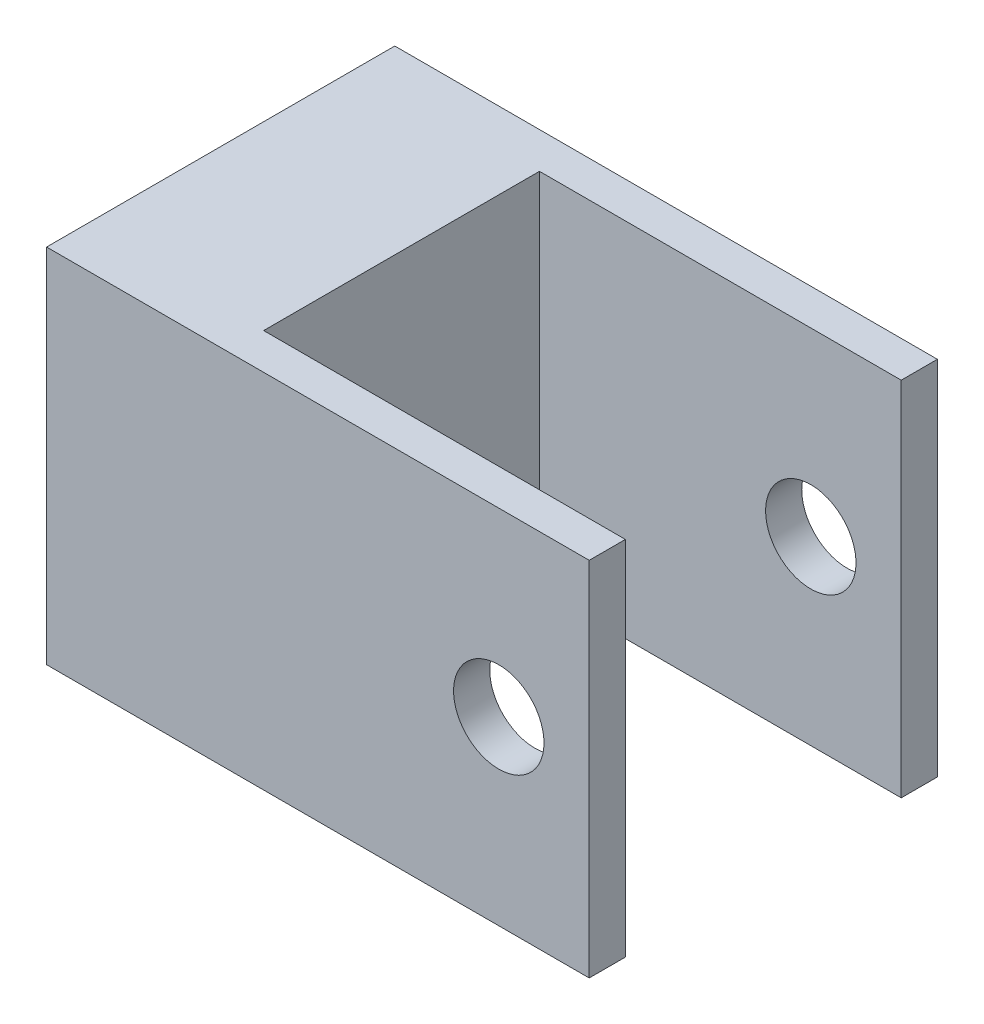
ISO-10303-21;
HEADER;
FILE_DESCRIPTION(('STEP AP214'),'2;1');
FILE_NAME('part.step','',(''),(''),'','','');
FILE_SCHEMA(('AUTOMOTIVE_DESIGN { 1 0 10303 214 1 1 1 1 }'));
ENDSEC;
DATA;
#1=APPLICATION_CONTEXT('core data for automotive mechanical design processes');
#2=APPLICATION_PROTOCOL_DEFINITION('international standard','automotive_design',2000,#1);
#3=PRODUCT_CONTEXT('',#1,'mechanical');
#4=PRODUCT('Part','Part','',(#3));
#5=PRODUCT_RELATED_PRODUCT_CATEGORY('part','',(#4));
#6=PRODUCT_DEFINITION_FORMATION('','',#4);
#7=PRODUCT_DEFINITION_CONTEXT('part definition',#1,'design');
#8=PRODUCT_DEFINITION('design','',#6,#7);
#9=PRODUCT_DEFINITION_SHAPE('','',#8);
#10=(LENGTH_UNIT() NAMED_UNIT(*) SI_UNIT(.MILLI.,.METRE.));
#11=(NAMED_UNIT(*) PLANE_ANGLE_UNIT() SI_UNIT($,.RADIAN.));
#12=(NAMED_UNIT(*) SI_UNIT($,.STERADIAN.) SOLID_ANGLE_UNIT());
#13=UNCERTAINTY_MEASURE_WITH_UNIT(LENGTH_MEASURE(1.E-05),#10,'distance_accuracy_value','');
#14=(GEOMETRIC_REPRESENTATION_CONTEXT(3) GLOBAL_UNCERTAINTY_ASSIGNED_CONTEXT((#13)) GLOBAL_UNIT_ASSIGNED_CONTEXT((#10,
#11,#12)) REPRESENTATION_CONTEXT('',''));
#15=CARTESIAN_POINT('',(0.,0.,0.));
#16=DIRECTION('',(0.,0.,1.));
#17=DIRECTION('',(1.,0.,0.));
#18=AXIS2_PLACEMENT_3D('',#15,#16,#17);
#19=CARTESIAN_POINT('',(120.,-40.,38.5));
#20=DIRECTION('',(1.,0.,0.));
#21=DIRECTION('',(0.,0.,-1.));
#22=AXIS2_PLACEMENT_3D('',#19,#20,#21);
#23=PLANE('',#22);
#24=DIRECTION('',(0.,0.,-1.));
#25=VECTOR('',#24,1.);
#26=CARTESIAN_POINT('',(120.,-40.,38.5));
#27=LINE('',#26,#25);
#28=CARTESIAN_POINT('',(120.,-40.,38.5));
#29=VERTEX_POINT('',#28);
#30=CARTESIAN_POINT('',(120.,-40.,30.5));
#31=VERTEX_POINT('',#30);
#32=EDGE_CURVE('E150',#29,#31,#27,.T.);
#33=ORIENTED_EDGE('',*,*,#32,.T.);
#34=DIRECTION('',(0.,1.,0.));
#35=VECTOR('',#34,1.);
#36=CARTESIAN_POINT('',(120.,-100.,30.5));
#37=LINE('',#36,#35);
#38=CARTESIAN_POINT('',(120.,40.,30.5));
#39=VERTEX_POINT('',#38);
#40=EDGE_CURVE('E130',#31,#39,#37,.T.);
#41=ORIENTED_EDGE('',*,*,#40,.T.);
#42=DIRECTION('',(0.,0.,-1.));
#43=VECTOR('',#42,1.);
#44=CARTESIAN_POINT('',(120.,40.,38.5));
#45=LINE('',#44,#43);
#46=CARTESIAN_POINT('',(120.,40.,38.5));
#47=VERTEX_POINT('',#46);
#48=EDGE_CURVE('E131',#47,#39,#45,.T.);
#49=ORIENTED_EDGE('',*,*,#48,.F.);
#50=DIRECTION('',(0.,1.,0.));
#51=VECTOR('',#50,1.);
#52=CARTESIAN_POINT('',(120.,-40.,38.5));
#53=LINE('',#52,#51);
#54=EDGE_CURVE('E62',#29,#47,#53,.T.);
#55=ORIENTED_EDGE('',*,*,#54,.F.);
#56=EDGE_LOOP('',(#33,#41,#49,#55));
#57=FACE_BOUND('',#56,.T.);
#58=ADVANCED_FACE('F39',(#57),#23,.T.);
#59=DIRECTION('',(0.,1.,0.));
#60=VECTOR('',#59,1.);
#61=CARTESIAN_POINT('',(120.,-100.,-30.5));
#62=LINE('',#61,#60);
#63=CARTESIAN_POINT('',(120.,-40.,-30.5));
#64=VERTEX_POINT('',#63);
#65=CARTESIAN_POINT('',(120.,40.,-30.5));
#66=VERTEX_POINT('',#65);
#67=EDGE_CURVE('E54',#64,#66,#62,.T.);
#68=ORIENTED_EDGE('',*,*,#67,.F.);
#69=CARTESIAN_POINT('',(120.,-40.,-38.5));
#70=VERTEX_POINT('',#69);
#71=EDGE_CURVE('E127',#64,#70,#27,.T.);
#72=ORIENTED_EDGE('',*,*,#71,.T.);
#73=DIRECTION('',(0.,1.,0.));
#74=VECTOR('',#73,1.);
#75=CARTESIAN_POINT('',(120.,-40.,-38.5));
#76=LINE('',#75,#74);
#77=CARTESIAN_POINT('',(120.,40.,-38.5));
#78=VERTEX_POINT('',#77);
#79=EDGE_CURVE('E158',#70,#78,#76,.T.);
#80=ORIENTED_EDGE('',*,*,#79,.T.);
#81=EDGE_CURVE('E135',#66,#78,#45,.T.);
#82=ORIENTED_EDGE('',*,*,#81,.F.);
#83=EDGE_LOOP('',(#68,#72,#80,#82));
#84=FACE_BOUND('',#83,.T.);
#85=ADVANCED_FACE('F41',(#84),#23,.T.);
#86=CARTESIAN_POINT('',(0.,-40.,38.5));
#87=DIRECTION('',(0.,0.,1.));
#88=DIRECTION('',(1.,0.,0.));
#89=AXIS2_PLACEMENT_3D('',#86,#87,#88);
#90=PLANE('',#89);
#91=CARTESIAN_POINT('',(100.,0.,38.5));
#92=DIRECTION('',(0.,0.,1.));
#93=DIRECTION('',(1.,0.,0.));
#94=AXIS2_PLACEMENT_3D('',#91,#92,#93);
#95=CIRCLE('',#94,9.99999999999999);
#96=CARTESIAN_POINT('',(110.,0.,38.5));
#97=VERTEX_POINT('',#96);
#98=EDGE_CURVE('E175',#97,#97,#95,.T.);
#99=ORIENTED_EDGE('',*,*,#98,.F.);
#100=EDGE_LOOP('',(#99));
#101=FACE_BOUND('',#100,.T.);
#102=ORIENTED_EDGE('',*,*,#54,.T.);
#103=DIRECTION('',(1.,0.,0.));
#104=VECTOR('',#103,1.);
#105=CARTESIAN_POINT('',(0.,40.,38.5));
#106=LINE('',#105,#104);
#107=CARTESIAN_POINT('',(0.,40.,38.5));
#108=VERTEX_POINT('',#107);
#109=EDGE_CURVE('E145',#108,#47,#106,.T.);
#110=ORIENTED_EDGE('',*,*,#109,.F.);
#111=DIRECTION('',(0.,1.,0.));
#112=VECTOR('',#111,1.);
#113=CARTESIAN_POINT('',(0.,-40.,38.5));
#114=LINE('',#113,#112);
#115=CARTESIAN_POINT('',(0.,-40.,38.5));
#116=VERTEX_POINT('',#115);
#117=EDGE_CURVE('E159',#116,#108,#114,.T.);
#118=ORIENTED_EDGE('',*,*,#117,.F.);
#119=DIRECTION('',(1.,0.,0.));
#120=VECTOR('',#119,1.);
#121=CARTESIAN_POINT('',(0.,-40.,38.5));
#122=LINE('',#121,#120);
#123=EDGE_CURVE('E154',#116,#29,#122,.T.);
#124=ORIENTED_EDGE('',*,*,#123,.T.);
#125=EDGE_LOOP('',(#102,#110,#118,#124));
#126=FACE_BOUND('',#125,.T.);
#127=ADVANCED_FACE('F202',(#101,#126),#90,.T.);
#128=CARTESIAN_POINT('',(0.,-40.,38.5));
#129=DIRECTION('',(-1.,0.,0.));
#130=DIRECTION('',(0.,0.,1.));
#131=AXIS2_PLACEMENT_3D('',#128,#129,#130);
#132=PLANE('',#131);
#133=ORIENTED_EDGE('',*,*,#117,.T.);
#134=DIRECTION('',(0.,0.,1.));
#135=VECTOR('',#134,1.);
#136=CARTESIAN_POINT('',(0.,40.,38.5));
#137=LINE('',#136,#135);
#138=CARTESIAN_POINT('',(0.,40.,-38.5));
#139=VERTEX_POINT('',#138);
#140=EDGE_CURVE('E143',#139,#108,#137,.T.);
#141=ORIENTED_EDGE('',*,*,#140,.F.);
#142=DIRECTION('',(0.,1.,0.));
#143=VECTOR('',#142,1.);
#144=CARTESIAN_POINT('',(0.,-40.,-38.5));
#145=LINE('',#144,#143);
#146=CARTESIAN_POINT('',(0.,-40.,-38.5));
#147=VERTEX_POINT('',#146);
#148=EDGE_CURVE('E165',#147,#139,#145,.T.);
#149=ORIENTED_EDGE('',*,*,#148,.F.);
#150=DIRECTION('',(0.,0.,1.));
#151=VECTOR('',#150,1.);
#152=CARTESIAN_POINT('',(0.,-40.,38.5));
#153=LINE('',#152,#151);
#154=EDGE_CURVE('E155',#147,#116,#153,.T.);
#155=ORIENTED_EDGE('',*,*,#154,.T.);
#156=EDGE_LOOP('',(#133,#141,#149,#155));
#157=FACE_BOUND('',#156,.T.);
#158=ADVANCED_FACE('F213',(#157),#132,.T.);
#159=CARTESIAN_POINT('',(0.,-40.,-38.5));
#160=DIRECTION('',(0.,0.,-1.));
#161=DIRECTION('',(-1.,0.,0.));
#162=AXIS2_PLACEMENT_3D('',#159,#160,#161);
#163=PLANE('',#162);
#164=CARTESIAN_POINT('',(100.,0.,-38.5));
#165=DIRECTION('',(0.,0.,-1.));
#166=DIRECTION('',(-1.,0.,0.));
#167=AXIS2_PLACEMENT_3D('',#164,#165,#166);
#168=CIRCLE('',#167,9.99999999999999);
#169=CARTESIAN_POINT('',(90.,0.,-38.5));
#170=VERTEX_POINT('',#169);
#171=EDGE_CURVE('E180',#170,#170,#168,.T.);
#172=ORIENTED_EDGE('',*,*,#171,.F.);
#173=EDGE_LOOP('',(#172));
#174=FACE_BOUND('',#173,.T.);
#175=ORIENTED_EDGE('',*,*,#148,.T.);
#176=DIRECTION('',(-1.,0.,0.));
#177=VECTOR('',#176,1.);
#178=CARTESIAN_POINT('',(0.,40.,-38.5));
#179=LINE('',#178,#177);
#180=EDGE_CURVE('E137',#78,#139,#179,.T.);
#181=ORIENTED_EDGE('',*,*,#180,.F.);
#182=ORIENTED_EDGE('',*,*,#79,.F.);
#183=DIRECTION('',(-1.,0.,0.));
#184=VECTOR('',#183,1.);
#185=CARTESIAN_POINT('',(0.,-40.,-38.5));
#186=LINE('',#185,#184);
#187=EDGE_CURVE('E149',#70,#147,#186,.T.);
#188=ORIENTED_EDGE('',*,*,#187,.T.);
#189=EDGE_LOOP('',(#175,#181,#182,#188));
#190=FACE_BOUND('',#189,.T.);
#191=ADVANCED_FACE('F216',(#174,#190),#163,.T.);
#192=CARTESIAN_POINT('',(0.,-40.,0.));
#193=DIRECTION('',(0.,-1.,0.));
#194=DIRECTION('',(0.,0.,-1.));
#195=AXIS2_PLACEMENT_3D('',#192,#193,#194);
#196=PLANE('',#195);
#197=DIRECTION('',(-1.,0.,0.));
#198=VECTOR('',#197,1.);
#199=CARTESIAN_POINT('',(0.,-40.,30.5));
#200=LINE('',#199,#198);
#201=CARTESIAN_POINT('',(40.,-40.,30.5));
#202=VERTEX_POINT('',#201);
#203=EDGE_CURVE('E119',#31,#202,#200,.T.);
#204=ORIENTED_EDGE('',*,*,#203,.F.);
#205=ORIENTED_EDGE('',*,*,#32,.F.);
#206=ORIENTED_EDGE('',*,*,#123,.F.);
#207=ORIENTED_EDGE('',*,*,#154,.F.);
#208=ORIENTED_EDGE('',*,*,#187,.F.);
#209=ORIENTED_EDGE('',*,*,#71,.F.);
#210=DIRECTION('',(1.,0.,0.));
#211=VECTOR('',#210,1.);
#212=CARTESIAN_POINT('',(0.,-40.,-30.5));
#213=LINE('',#212,#211);
#214=CARTESIAN_POINT('',(40.,-40.,-30.5));
#215=VERTEX_POINT('',#214);
#216=EDGE_CURVE('E117',#215,#64,#213,.T.);
#217=ORIENTED_EDGE('',*,*,#216,.F.);
#218=DIRECTION('',(0.,0.,-1.));
#219=VECTOR('',#218,1.);
#220=CARTESIAN_POINT('',(40.,-40.,0.));
#221=LINE('',#220,#219);
#222=EDGE_CURVE('E110',#202,#215,#221,.T.);
#223=ORIENTED_EDGE('',*,*,#222,.F.);
#224=EDGE_LOOP('',(#204,#205,#206,#207,#208,#209,#217,#223));
#225=FACE_BOUND('',#224,.T.);
#226=ADVANCED_FACE('F123',(#225),#196,.T.);
#227=CARTESIAN_POINT('',(0.,40.,0.));
#228=DIRECTION('',(0.,-1.,0.));
#229=DIRECTION('',(0.,0.,-1.));
#230=AXIS2_PLACEMENT_3D('',#227,#228,#229);
#231=PLANE('',#230);
#232=ORIENTED_EDGE('',*,*,#48,.T.);
#233=DIRECTION('',(-1.,0.,0.));
#234=VECTOR('',#233,1.);
#235=CARTESIAN_POINT('',(0.,40.,30.5));
#236=LINE('',#235,#234);
#237=CARTESIAN_POINT('',(40.,40.,30.5));
#238=VERTEX_POINT('',#237);
#239=EDGE_CURVE('E11',#39,#238,#236,.T.);
#240=ORIENTED_EDGE('',*,*,#239,.T.);
#241=DIRECTION('',(0.,0.,-1.));
#242=VECTOR('',#241,1.);
#243=CARTESIAN_POINT('',(40.,40.,0.));
#244=LINE('',#243,#242);
#245=CARTESIAN_POINT('',(40.,40.,-30.5));
#246=VERTEX_POINT('',#245);
#247=EDGE_CURVE('E48',#238,#246,#244,.T.);
#248=ORIENTED_EDGE('',*,*,#247,.T.);
#249=DIRECTION('',(1.,0.,0.));
#250=VECTOR('',#249,1.);
#251=CARTESIAN_POINT('',(0.,40.,-30.5));
#252=LINE('',#251,#250);
#253=EDGE_CURVE('E121',#246,#66,#252,.T.);
#254=ORIENTED_EDGE('',*,*,#253,.T.);
#255=ORIENTED_EDGE('',*,*,#81,.T.);
#256=ORIENTED_EDGE('',*,*,#180,.T.);
#257=ORIENTED_EDGE('',*,*,#140,.T.);
#258=ORIENTED_EDGE('',*,*,#109,.T.);
#259=EDGE_LOOP('',(#232,#240,#248,#254,#255,#256,#257,#258));
#260=FACE_BOUND('',#259,.T.);
#261=ADVANCED_FACE('F169',(#260),#231,.F.);
#262=CARTESIAN_POINT('',(40.,-100.,30.5));
#263=DIRECTION('',(0.,0.,1.));
#264=DIRECTION('',(1.,0.,0.));
#265=AXIS2_PLACEMENT_3D('',#262,#263,#264);
#266=PLANE('',#265);
#267=CARTESIAN_POINT('',(100.,0.,30.5));
#268=DIRECTION('',(0.,0.,1.));
#269=DIRECTION('',(1.,0.,0.));
#270=AXIS2_PLACEMENT_3D('',#267,#268,#269);
#271=CIRCLE('',#270,9.99999999999999);
#272=CARTESIAN_POINT('',(110.,0.,30.5));
#273=VERTEX_POINT('',#272);
#274=EDGE_CURVE('E179',#273,#273,#271,.T.);
#275=ORIENTED_EDGE('',*,*,#274,.T.);
#276=EDGE_LOOP('',(#275));
#277=FACE_BOUND('',#276,.T.);
#278=ORIENTED_EDGE('',*,*,#203,.T.);
#279=DIRECTION('',(0.,1.,0.));
#280=VECTOR('',#279,1.);
#281=CARTESIAN_POINT('',(40.,-100.,30.5));
#282=LINE('',#281,#280);
#283=EDGE_CURVE('E114',#202,#238,#282,.T.);
#284=ORIENTED_EDGE('',*,*,#283,.T.);
#285=ORIENTED_EDGE('',*,*,#239,.F.);
#286=ORIENTED_EDGE('',*,*,#40,.F.);
#287=EDGE_LOOP('',(#278,#284,#285,#286));
#288=FACE_BOUND('',#287,.T.);
#289=ADVANCED_FACE('F173',(#277,#288),#266,.F.);
#290=CARTESIAN_POINT('',(40.,-100.,30.5));
#291=DIRECTION('',(-1.,0.,0.));
#292=DIRECTION('',(0.,0.,1.));
#293=AXIS2_PLACEMENT_3D('',#290,#291,#292);
#294=PLANE('',#293);
#295=ORIENTED_EDGE('',*,*,#222,.T.);
#296=DIRECTION('',(0.,1.,0.));
#297=VECTOR('',#296,1.);
#298=CARTESIAN_POINT('',(40.,-100.,-30.5));
#299=LINE('',#298,#297);
#300=EDGE_CURVE('E109',#215,#246,#299,.T.);
#301=ORIENTED_EDGE('',*,*,#300,.T.);
#302=ORIENTED_EDGE('',*,*,#247,.F.);
#303=ORIENTED_EDGE('',*,*,#283,.F.);
#304=EDGE_LOOP('',(#295,#301,#302,#303));
#305=FACE_BOUND('',#304,.T.);
#306=ADVANCED_FACE('F108',(#305),#294,.F.);
#307=CARTESIAN_POINT('',(40.,-100.,-30.5));
#308=DIRECTION('',(0.,0.,-1.));
#309=DIRECTION('',(-1.,0.,0.));
#310=AXIS2_PLACEMENT_3D('',#307,#308,#309);
#311=PLANE('',#310);
#312=CARTESIAN_POINT('',(100.,0.,-30.5));
#313=DIRECTION('',(0.,0.,-1.));
#314=DIRECTION('',(-1.,0.,0.));
#315=AXIS2_PLACEMENT_3D('',#312,#313,#314);
#316=CIRCLE('',#315,9.99999999999999);
#317=CARTESIAN_POINT('',(90.,0.,-30.5));
#318=VERTEX_POINT('',#317);
#319=EDGE_CURVE('E43',#318,#318,#316,.T.);
#320=ORIENTED_EDGE('',*,*,#319,.T.);
#321=EDGE_LOOP('',(#320));
#322=FACE_BOUND('',#321,.T.);
#323=ORIENTED_EDGE('',*,*,#216,.T.);
#324=ORIENTED_EDGE('',*,*,#67,.T.);
#325=ORIENTED_EDGE('',*,*,#253,.F.);
#326=ORIENTED_EDGE('',*,*,#300,.F.);
#327=EDGE_LOOP('',(#323,#324,#325,#326));
#328=FACE_BOUND('',#327,.T.);
#329=ADVANCED_FACE('F116',(#322,#328),#311,.F.);
#330=CARTESIAN_POINT('',(100.,0.,-100.));
#331=DIRECTION('',(0.,0.,1.));
#332=DIRECTION('',(1.,0.,0.));
#333=AXIS2_PLACEMENT_3D('',#330,#331,#332);
#334=CYLINDRICAL_SURFACE('',#333,9.99999999999999);
#335=ORIENTED_EDGE('',*,*,#171,.T.);
#336=EDGE_LOOP('',(#335));
#337=FACE_BOUND('',#336,.T.);
#338=ORIENTED_EDGE('',*,*,#319,.F.);
#339=EDGE_LOOP('',(#338));
#340=FACE_BOUND('',#339,.T.);
#341=ADVANCED_FACE('F187',(#337,#340),#334,.F.);
#342=ORIENTED_EDGE('',*,*,#98,.T.);
#343=EDGE_LOOP('',(#342));
#344=FACE_BOUND('',#343,.T.);
#345=ORIENTED_EDGE('',*,*,#274,.F.);
#346=EDGE_LOOP('',(#345));
#347=FACE_BOUND('',#346,.T.);
#348=ADVANCED_FACE('F186',(#344,#347),#334,.F.);
#349=CLOSED_SHELL('',(#58,#85,#127,#158,#191,#226,#261,#289,#306,#329,#341,#348));
#350=MANIFOLD_SOLID_BREP('B2',#349);
#351=ADVANCED_BREP_SHAPE_REPRESENTATION('',(#18,#350),#14);
#352=SHAPE_DEFINITION_REPRESENTATION(#9,#351);
ENDSEC;
END-ISO-10303-21;
